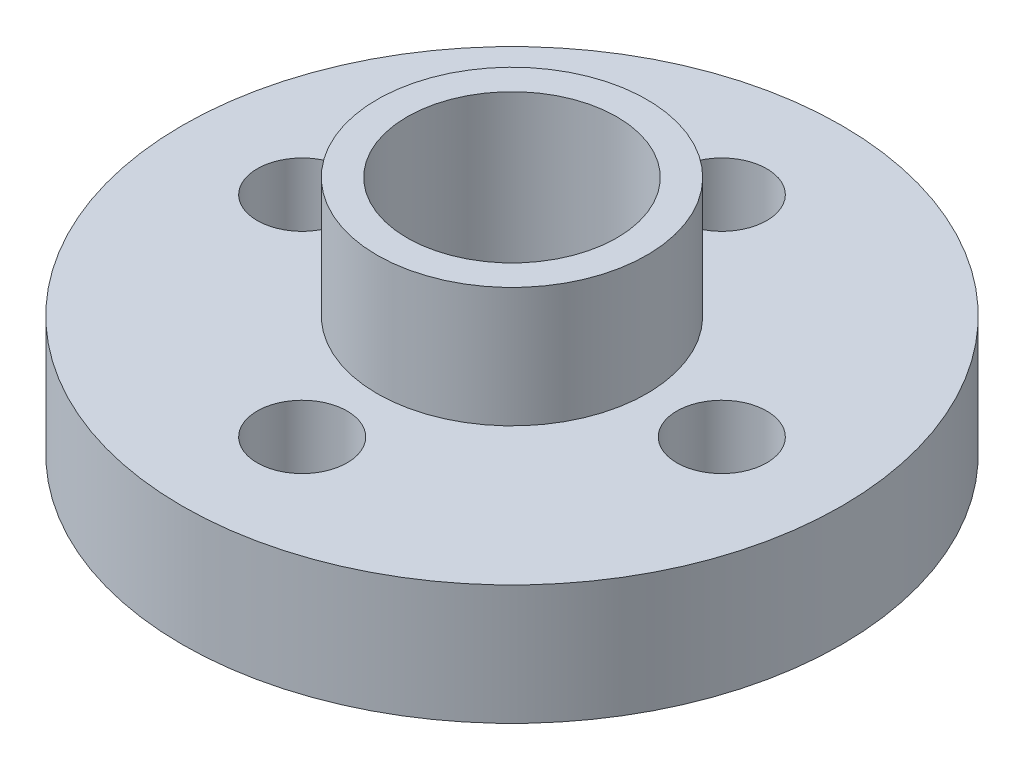
ISO-10303-21;
HEADER;
FILE_DESCRIPTION(('STEP AP214'),'2;1');
FILE_NAME('part.step','',(''),(''),'','','');
FILE_SCHEMA(('AUTOMOTIVE_DESIGN { 1 0 10303 214 1 1 1 1 }'));
ENDSEC;
DATA;
#1=APPLICATION_CONTEXT('core data for automotive mechanical design processes');
#2=APPLICATION_PROTOCOL_DEFINITION('international standard','automotive_design',2000,#1);
#3=PRODUCT_CONTEXT('',#1,'mechanical');
#4=PRODUCT('Part','Part','',(#3));
#5=PRODUCT_RELATED_PRODUCT_CATEGORY('part','',(#4));
#6=PRODUCT_DEFINITION_FORMATION('','',#4);
#7=PRODUCT_DEFINITION_CONTEXT('part definition',#1,'design');
#8=PRODUCT_DEFINITION('design','',#6,#7);
#9=PRODUCT_DEFINITION_SHAPE('','',#8);
#10=(LENGTH_UNIT() NAMED_UNIT(*) SI_UNIT(.MILLI.,.METRE.));
#11=(NAMED_UNIT(*) PLANE_ANGLE_UNIT() SI_UNIT($,.RADIAN.));
#12=(NAMED_UNIT(*) SI_UNIT($,.STERADIAN.) SOLID_ANGLE_UNIT());
#13=UNCERTAINTY_MEASURE_WITH_UNIT(LENGTH_MEASURE(1.E-05),#10,'distance_accuracy_value','');
#14=(GEOMETRIC_REPRESENTATION_CONTEXT(3) GLOBAL_UNCERTAINTY_ASSIGNED_CONTEXT((#13)) GLOBAL_UNIT_ASSIGNED_CONTEXT((#10,
#11,#12)) REPRESENTATION_CONTEXT('',''));
#15=CARTESIAN_POINT('',(0.,0.,0.));
#16=DIRECTION('',(0.,0.,1.));
#17=DIRECTION('',(1.,0.,0.));
#18=AXIS2_PLACEMENT_3D('',#15,#16,#17);
#19=CARTESIAN_POINT('',(0.,8.,0.));
#20=DIRECTION('',(0.,-1.,0.));
#21=DIRECTION('',(0.,0.,-1.));
#22=AXIS2_PLACEMENT_3D('',#19,#20,#21);
#23=CYLINDRICAL_SURFACE('',#22,11.);
#24=CARTESIAN_POINT('',(0.,0.,0.));
#25=DIRECTION('',(0.,1.,0.));
#26=DIRECTION('',(0.,0.,1.));
#27=AXIS2_PLACEMENT_3D('',#24,#25,#26);
#28=CIRCLE('',#27,11.);
#29=CARTESIAN_POINT('',(0.,0.,11.));
#30=VERTEX_POINT('',#29);
#31=EDGE_CURVE('E10',#30,#30,#28,.T.);
#32=ORIENTED_EDGE('',*,*,#31,.T.);
#33=EDGE_LOOP('',(#32));
#34=FACE_BOUND('',#33,.T.);
#35=CARTESIAN_POINT('',(0.,4.,0.));
#36=DIRECTION('',(0.,1.,0.));
#37=DIRECTION('',(0.,0.,1.));
#38=AXIS2_PLACEMENT_3D('',#35,#36,#37);
#39=CIRCLE('',#38,11.);
#40=CARTESIAN_POINT('',(0.,4.,11.));
#41=VERTEX_POINT('',#40);
#42=EDGE_CURVE('E59',#41,#41,#39,.T.);
#43=ORIENTED_EDGE('',*,*,#42,.F.);
#44=EDGE_LOOP('',(#43));
#45=FACE_BOUND('',#44,.T.);
#46=ADVANCED_FACE('F31',(#34,#45),#23,.T.);
#47=CARTESIAN_POINT('',(0.,8.,0.));
#48=DIRECTION('',(0.,1.,0.));
#49=DIRECTION('',(0.,0.,1.));
#50=AXIS2_PLACEMENT_3D('',#47,#48,#49);
#51=PLANE('',#50);
#52=CARTESIAN_POINT('',(0.,8.,0.));
#53=DIRECTION('',(0.,1.,0.));
#54=DIRECTION('',(0.,0.,1.));
#55=AXIS2_PLACEMENT_3D('',#52,#53,#54);
#56=CIRCLE('',#55,3.5);
#57=CARTESIAN_POINT('',(0.,8.,3.5));
#58=VERTEX_POINT('',#57);
#59=EDGE_CURVE('E198',#58,#58,#56,.T.);
#60=ORIENTED_EDGE('',*,*,#59,.F.);
#61=EDGE_LOOP('',(#60));
#62=FACE_BOUND('',#61,.T.);
#63=CARTESIAN_POINT('',(0.,8.,0.));
#64=DIRECTION('',(0.,1.,0.));
#65=DIRECTION('',(0.,0.,1.));
#66=AXIS2_PLACEMENT_3D('',#63,#64,#65);
#67=CIRCLE('',#66,4.5);
#68=CARTESIAN_POINT('',(0.,8.,4.5));
#69=VERTEX_POINT('',#68);
#70=EDGE_CURVE('E71',#69,#69,#67,.T.);
#71=ORIENTED_EDGE('',*,*,#70,.T.);
#72=EDGE_LOOP('',(#71));
#73=FACE_BOUND('',#72,.T.);
#74=ADVANCED_FACE('F85',(#62,#73),#51,.T.);
#75=CARTESIAN_POINT('',(0.,-4.00000000000001,7.));
#76=DIRECTION('',(0.,1.,0.));
#77=DIRECTION('',(0.,0.,1.));
#78=AXIS2_PLACEMENT_3D('',#75,#76,#77);
#79=CYLINDRICAL_SURFACE('',#78,1.5);
#80=CARTESIAN_POINT('',(0.,0.,7.));
#81=DIRECTION('',(0.,1.,0.));
#82=DIRECTION('',(0.,0.,1.));
#83=AXIS2_PLACEMENT_3D('',#80,#81,#82);
#84=CIRCLE('',#83,1.5);
#85=CARTESIAN_POINT('',(0.,0.,8.5));
#86=VERTEX_POINT('',#85);
#87=EDGE_CURVE('E49',#86,#86,#84,.T.);
#88=ORIENTED_EDGE('',*,*,#87,.F.);
#89=EDGE_LOOP('',(#88));
#90=FACE_BOUND('',#89,.T.);
#91=CARTESIAN_POINT('',(0.,4.,7.));
#92=DIRECTION('',(0.,1.,0.));
#93=DIRECTION('',(0.,0.,1.));
#94=AXIS2_PLACEMENT_3D('',#91,#92,#93);
#95=CIRCLE('',#94,1.5);
#96=CARTESIAN_POINT('',(0.,4.,8.5));
#97=VERTEX_POINT('',#96);
#98=EDGE_CURVE('E47',#97,#97,#95,.F.);
#99=ORIENTED_EDGE('',*,*,#98,.F.);
#100=EDGE_LOOP('',(#99));
#101=FACE_BOUND('',#100,.T.);
#102=ADVANCED_FACE('F82',(#90,#101),#79,.F.);
#103=CARTESIAN_POINT('',(7.,-4.00000000000001,0.));
#104=DIRECTION('',(0.,1.,0.));
#105=DIRECTION('',(0.,0.,1.));
#106=AXIS2_PLACEMENT_3D('',#103,#104,#105);
#107=CYLINDRICAL_SURFACE('',#106,1.5);
#108=CARTESIAN_POINT('',(7.,0.,0.));
#109=DIRECTION('',(0.,1.,0.));
#110=DIRECTION('',(0.,0.,1.));
#111=AXIS2_PLACEMENT_3D('',#108,#109,#110);
#112=CIRCLE('',#111,1.5);
#113=CARTESIAN_POINT('',(7.,0.,1.5));
#114=VERTEX_POINT('',#113);
#115=EDGE_CURVE('E52',#114,#114,#112,.T.);
#116=ORIENTED_EDGE('',*,*,#115,.F.);
#117=EDGE_LOOP('',(#116));
#118=FACE_BOUND('',#117,.T.);
#119=CARTESIAN_POINT('',(7.,4.,0.));
#120=DIRECTION('',(0.,1.,0.));
#121=DIRECTION('',(0.,0.,1.));
#122=AXIS2_PLACEMENT_3D('',#119,#120,#121);
#123=CIRCLE('',#122,1.5);
#124=CARTESIAN_POINT('',(7.,4.,1.5));
#125=VERTEX_POINT('',#124);
#126=EDGE_CURVE('E63',#125,#125,#123,.F.);
#127=ORIENTED_EDGE('',*,*,#126,.F.);
#128=EDGE_LOOP('',(#127));
#129=FACE_BOUND('',#128,.T.);
#130=ADVANCED_FACE('F84',(#118,#129),#107,.F.);
#131=CARTESIAN_POINT('',(0.,-4.00000000000001,-7.));
#132=DIRECTION('',(0.,1.,0.));
#133=DIRECTION('',(0.,0.,1.));
#134=AXIS2_PLACEMENT_3D('',#131,#132,#133);
#135=CYLINDRICAL_SURFACE('',#134,1.5);
#136=CARTESIAN_POINT('',(0.,0.,-7.));
#137=DIRECTION('',(0.,1.,0.));
#138=DIRECTION('',(0.,0.,1.));
#139=AXIS2_PLACEMENT_3D('',#136,#137,#138);
#140=CIRCLE('',#139,1.5);
#141=CARTESIAN_POINT('',(0.,0.,-5.5));
#142=VERTEX_POINT('',#141);
#143=EDGE_CURVE('E43',#142,#142,#140,.T.);
#144=ORIENTED_EDGE('',*,*,#143,.F.);
#145=EDGE_LOOP('',(#144));
#146=FACE_BOUND('',#145,.T.);
#147=CARTESIAN_POINT('',(0.,4.,-7.));
#148=DIRECTION('',(0.,1.,0.));
#149=DIRECTION('',(0.,0.,1.));
#150=AXIS2_PLACEMENT_3D('',#147,#148,#149);
#151=CIRCLE('',#150,1.5);
#152=CARTESIAN_POINT('',(0.,4.,-5.5));
#153=VERTEX_POINT('',#152);
#154=EDGE_CURVE('E58',#153,#153,#151,.F.);
#155=ORIENTED_EDGE('',*,*,#154,.F.);
#156=EDGE_LOOP('',(#155));
#157=FACE_BOUND('',#156,.T.);
#158=ADVANCED_FACE('F92',(#146,#157),#135,.F.);
#159=CARTESIAN_POINT('',(-7.,-4.00000000000001,0.));
#160=DIRECTION('',(0.,1.,0.));
#161=DIRECTION('',(0.,0.,1.));
#162=AXIS2_PLACEMENT_3D('',#159,#160,#161);
#163=CYLINDRICAL_SURFACE('',#162,1.5);
#164=CARTESIAN_POINT('',(-7.,0.,0.));
#165=DIRECTION('',(0.,1.,0.));
#166=DIRECTION('',(0.,0.,1.));
#167=AXIS2_PLACEMENT_3D('',#164,#165,#166);
#168=CIRCLE('',#167,1.5);
#169=CARTESIAN_POINT('',(-7.,0.,1.5));
#170=VERTEX_POINT('',#169);
#171=EDGE_CURVE('E38',#170,#170,#168,.T.);
#172=ORIENTED_EDGE('',*,*,#171,.F.);
#173=EDGE_LOOP('',(#172));
#174=FACE_BOUND('',#173,.T.);
#175=CARTESIAN_POINT('',(-7.,4.,0.));
#176=DIRECTION('',(0.,1.,0.));
#177=DIRECTION('',(0.,0.,1.));
#178=AXIS2_PLACEMENT_3D('',#175,#176,#177);
#179=CIRCLE('',#178,1.5);
#180=CARTESIAN_POINT('',(-7.,4.,1.5));
#181=VERTEX_POINT('',#180);
#182=EDGE_CURVE('E56',#181,#181,#179,.F.);
#183=ORIENTED_EDGE('',*,*,#182,.F.);
#184=EDGE_LOOP('',(#183));
#185=FACE_BOUND('',#184,.T.);
#186=ADVANCED_FACE('F124',(#174,#185),#163,.F.);
#187=CARTESIAN_POINT('',(0.,0.,0.));
#188=DIRECTION('',(0.,1.,0.));
#189=DIRECTION('',(0.,0.,1.));
#190=AXIS2_PLACEMENT_3D('',#187,#188,#189);
#191=PLANE('',#190);
#192=CARTESIAN_POINT('',(0.,0.,0.));
#193=DIRECTION('',(0.,1.,0.));
#194=DIRECTION('',(0.,0.,1.));
#195=AXIS2_PLACEMENT_3D('',#192,#193,#194);
#196=CIRCLE('',#195,3.5);
#197=CARTESIAN_POINT('',(0.,0.,3.5));
#198=VERTEX_POINT('',#197);
#199=EDGE_CURVE('E34',#198,#198,#196,.T.);
#200=ORIENTED_EDGE('',*,*,#199,.T.);
#201=EDGE_LOOP('',(#200));
#202=FACE_BOUND('',#201,.T.);
#203=ORIENTED_EDGE('',*,*,#171,.T.);
#204=EDGE_LOOP('',(#203));
#205=FACE_BOUND('',#204,.T.);
#206=ORIENTED_EDGE('',*,*,#143,.T.);
#207=EDGE_LOOP('',(#206));
#208=FACE_BOUND('',#207,.T.);
#209=ORIENTED_EDGE('',*,*,#115,.T.);
#210=EDGE_LOOP('',(#209));
#211=FACE_BOUND('',#210,.T.);
#212=ORIENTED_EDGE('',*,*,#87,.T.);
#213=EDGE_LOOP('',(#212));
#214=FACE_BOUND('',#213,.T.);
#215=ORIENTED_EDGE('',*,*,#31,.F.);
#216=EDGE_LOOP('',(#215));
#217=FACE_BOUND('',#216,.T.);
#218=ADVANCED_FACE('F119',(#202,#205,#208,#211,#214,#217),#191,.F.);
#219=CARTESIAN_POINT('',(0.,4.,0.));
#220=DIRECTION('',(0.,1.,0.));
#221=DIRECTION('',(0.,0.,1.));
#222=AXIS2_PLACEMENT_3D('',#219,#220,#221);
#223=PLANE('',#222);
#224=CARTESIAN_POINT('',(0.,4.,0.));
#225=DIRECTION('',(0.,1.,0.));
#226=DIRECTION('',(0.,0.,1.));
#227=AXIS2_PLACEMENT_3D('',#224,#225,#226);
#228=CIRCLE('',#227,4.5);
#229=CARTESIAN_POINT('',(0.,4.,4.5));
#230=VERTEX_POINT('',#229);
#231=EDGE_CURVE('E66',#230,#230,#228,.T.);
#232=ORIENTED_EDGE('',*,*,#231,.F.);
#233=EDGE_LOOP('',(#232));
#234=FACE_BOUND('',#233,.T.);
#235=ORIENTED_EDGE('',*,*,#42,.T.);
#236=EDGE_LOOP('',(#235));
#237=FACE_BOUND('',#236,.T.);
#238=ORIENTED_EDGE('',*,*,#182,.T.);
#239=EDGE_LOOP('',(#238));
#240=FACE_BOUND('',#239,.T.);
#241=ORIENTED_EDGE('',*,*,#154,.T.);
#242=EDGE_LOOP('',(#241));
#243=FACE_BOUND('',#242,.T.);
#244=ORIENTED_EDGE('',*,*,#126,.T.);
#245=EDGE_LOOP('',(#244));
#246=FACE_BOUND('',#245,.T.);
#247=ORIENTED_EDGE('',*,*,#98,.T.);
#248=EDGE_LOOP('',(#247));
#249=FACE_BOUND('',#248,.T.);
#250=ADVANCED_FACE('F80',(#234,#237,#240,#243,#246,#249),#223,.T.);
#251=CARTESIAN_POINT('',(0.,4.,0.));
#252=DIRECTION('',(0.,1.,0.));
#253=DIRECTION('',(0.,0.,1.));
#254=AXIS2_PLACEMENT_3D('',#251,#252,#253);
#255=CYLINDRICAL_SURFACE('',#254,4.5);
#256=ORIENTED_EDGE('',*,*,#231,.T.);
#257=EDGE_LOOP('',(#256));
#258=FACE_BOUND('',#257,.T.);
#259=ORIENTED_EDGE('',*,*,#70,.F.);
#260=EDGE_LOOP('',(#259));
#261=FACE_BOUND('',#260,.T.);
#262=ADVANCED_FACE('F114',(#258,#261),#255,.T.);
#263=CARTESIAN_POINT('',(0.,-2.,0.));
#264=DIRECTION('',(0.,1.,0.));
#265=DIRECTION('',(0.,0.,1.));
#266=AXIS2_PLACEMENT_3D('',#263,#264,#265);
#267=CYLINDRICAL_SURFACE('',#266,3.5);
#268=ORIENTED_EDGE('',*,*,#59,.T.);
#269=EDGE_LOOP('',(#268));
#270=FACE_BOUND('',#269,.T.);
#271=ORIENTED_EDGE('',*,*,#199,.F.);
#272=EDGE_LOOP('',(#271));
#273=FACE_BOUND('',#272,.T.);
#274=ADVANCED_FACE('F132',(#270,#273),#267,.F.);
#275=CLOSED_SHELL('',(#46,#74,#102,#130,#158,#186,#218,#250,#262,#274));
#276=MANIFOLD_SOLID_BREP('B2',#275);
#277=ADVANCED_BREP_SHAPE_REPRESENTATION('',(#18,#276),#14);
#278=SHAPE_DEFINITION_REPRESENTATION(#9,#277);
ENDSEC;
END-ISO-10303-21;
